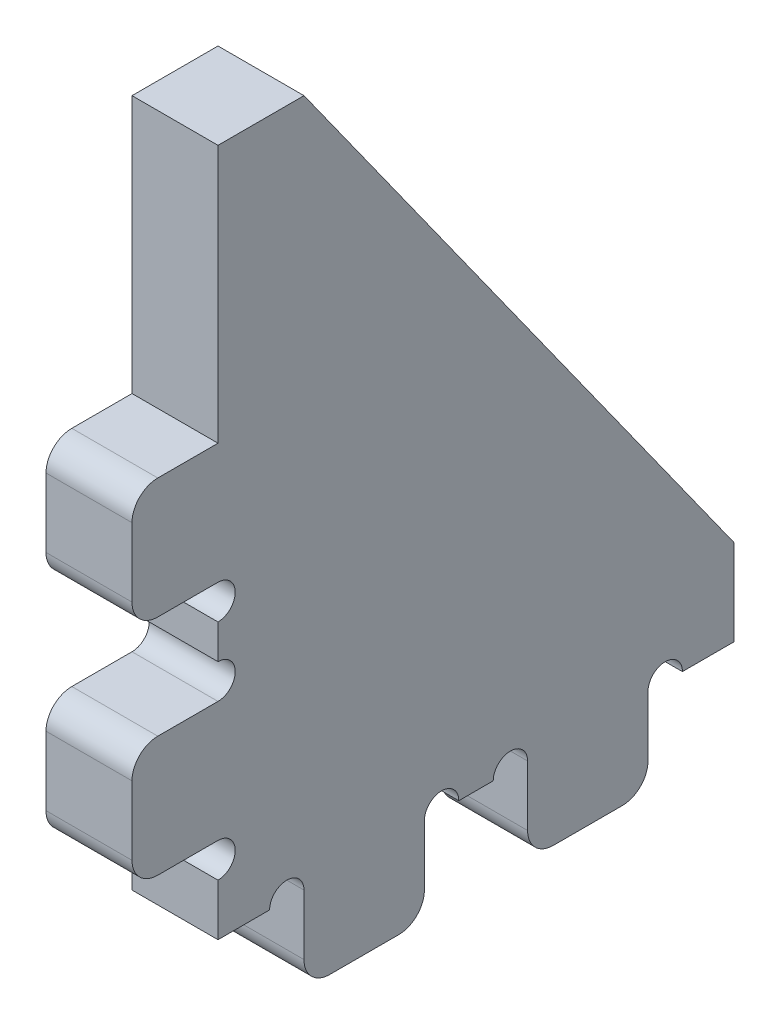
ISO-10303-21;
HEADER;
FILE_DESCRIPTION(('STEP AP214'),'2;1');
FILE_NAME('part.step','',(''),(''),'','','');
FILE_SCHEMA(('AUTOMOTIVE_DESIGN { 1 0 10303 214 1 1 1 1 }'));
ENDSEC;
DATA;
#1=APPLICATION_CONTEXT('core data for automotive mechanical design processes');
#2=APPLICATION_PROTOCOL_DEFINITION('international standard','automotive_design',2000,#1);
#3=PRODUCT_CONTEXT('',#1,'mechanical');
#4=PRODUCT('Part','Part','',(#3));
#5=PRODUCT_RELATED_PRODUCT_CATEGORY('part','',(#4));
#6=PRODUCT_DEFINITION_FORMATION('','',#4);
#7=PRODUCT_DEFINITION_CONTEXT('part definition',#1,'design');
#8=PRODUCT_DEFINITION('design','',#6,#7);
#9=PRODUCT_DEFINITION_SHAPE('','',#8);
#10=(LENGTH_UNIT() NAMED_UNIT(*) SI_UNIT(.MILLI.,.METRE.));
#11=(NAMED_UNIT(*) PLANE_ANGLE_UNIT() SI_UNIT($,.RADIAN.));
#12=(NAMED_UNIT(*) SI_UNIT($,.STERADIAN.) SOLID_ANGLE_UNIT());
#13=UNCERTAINTY_MEASURE_WITH_UNIT(LENGTH_MEASURE(1.E-05),#10,'distance_accuracy_value','');
#14=(GEOMETRIC_REPRESENTATION_CONTEXT(3) GLOBAL_UNCERTAINTY_ASSIGNED_CONTEXT((#13)) GLOBAL_UNIT_ASSIGNED_CONTEXT((#10,
#11,#12)) REPRESENTATION_CONTEXT('',''));
#15=CARTESIAN_POINT('',(0.,0.,0.));
#16=DIRECTION('',(0.,0.,1.));
#17=DIRECTION('',(1.,0.,0.));
#18=AXIS2_PLACEMENT_3D('',#15,#16,#17);
#19=CARTESIAN_POINT('',(5.,0.,0.));
#20=DIRECTION('',(0.,0.,-1.));
#21=DIRECTION('',(-1.,0.,0.));
#22=AXIS2_PLACEMENT_3D('',#19,#20,#21);
#23=PLANE('',#22);
#24=DIRECTION('',(0.,-1.,0.));
#25=VECTOR('',#24,1.);
#26=CARTESIAN_POINT('',(5.,0.,0.));
#27=LINE('',#26,#25);
#28=CARTESIAN_POINT('',(5.,16.,0.));
#29=VERTEX_POINT('',#28);
#30=CARTESIAN_POINT('',(5.,14.,0.));
#31=VERTEX_POINT('',#30);
#32=EDGE_CURVE('E286',#29,#31,#27,.T.);
#33=ORIENTED_EDGE('',*,*,#32,.F.);
#34=DIRECTION('',(1.,0.,0.));
#35=VECTOR('',#34,1.);
#36=CARTESIAN_POINT('',(0.,16.,0.));
#37=LINE('',#36,#35);
#38=CARTESIAN_POINT('',(0.,16.,0.));
#39=VERTEX_POINT('',#38);
#40=EDGE_CURVE('E269',#29,#39,#37,.F.);
#41=ORIENTED_EDGE('',*,*,#40,.T.);
#42=DIRECTION('',(0.,-1.,0.));
#43=VECTOR('',#42,1.);
#44=CARTESIAN_POINT('',(0.,0.,0.));
#45=LINE('',#44,#43);
#46=CARTESIAN_POINT('',(0.,14.,0.));
#47=VERTEX_POINT('',#46);
#48=EDGE_CURVE('E305',#39,#47,#45,.T.);
#49=ORIENTED_EDGE('',*,*,#48,.T.);
#50=DIRECTION('',(1.,0.,0.));
#51=VECTOR('',#50,1.);
#52=CARTESIAN_POINT('',(0.,14.,0.));
#53=LINE('',#52,#51);
#54=EDGE_CURVE('E293',#47,#31,#53,.T.);
#55=ORIENTED_EDGE('',*,*,#54,.T.);
#56=EDGE_LOOP('',(#33,#41,#49,#55));
#57=FACE_BOUND('',#56,.T.);
#58=ADVANCED_FACE('F34',(#57),#23,.F.);
#59=CARTESIAN_POINT('',(5.,3.,0.));
#60=VERTEX_POINT('',#59);
#61=CARTESIAN_POINT('',(5.,0.,0.));
#62=VERTEX_POINT('',#61);
#63=EDGE_CURVE('E295',#60,#62,#27,.T.);
#64=ORIENTED_EDGE('',*,*,#63,.F.);
#65=DIRECTION('',(1.,0.,0.));
#66=VECTOR('',#65,1.);
#67=CARTESIAN_POINT('',(0.,3.,0.));
#68=LINE('',#67,#66);
#69=CARTESIAN_POINT('',(0.,3.,0.));
#70=VERTEX_POINT('',#69);
#71=EDGE_CURVE('E507',#60,#70,#68,.F.);
#72=ORIENTED_EDGE('',*,*,#71,.T.);
#73=CARTESIAN_POINT('',(0.,0.,0.));
#74=VERTEX_POINT('',#73);
#75=EDGE_CURVE('E590',#70,#74,#45,.T.);
#76=ORIENTED_EDGE('',*,*,#75,.T.);
#77=DIRECTION('',(-1.,0.,0.));
#78=VECTOR('',#77,1.);
#79=CARTESIAN_POINT('',(5.,0.,0.));
#80=LINE('',#79,#78);
#81=EDGE_CURVE('E298',#62,#74,#80,.T.);
#82=ORIENTED_EDGE('',*,*,#81,.F.);
#83=EDGE_LOOP('',(#64,#72,#76,#82));
#84=FACE_BOUND('',#83,.T.);
#85=ADVANCED_FACE('F716',(#84),#23,.F.);
#86=CARTESIAN_POINT('',(5.,0.,-30.));
#87=DIRECTION('',(0.,1.,0.));
#88=DIRECTION('',(0.,0.,1.));
#89=AXIS2_PLACEMENT_3D('',#86,#87,#88);
#90=PLANE('',#89);
#91=DIRECTION('',(0.,0.,-1.));
#92=VECTOR('',#91,1.);
#93=CARTESIAN_POINT('',(0.,0.,-30.));
#94=LINE('',#93,#92);
#95=CARTESIAN_POINT('',(0.,0.,-14.));
#96=VERTEX_POINT('',#95);
#97=CARTESIAN_POINT('',(0.,0.,-16.));
#98=VERTEX_POINT('',#97);
#99=EDGE_CURVE('E563',#96,#98,#94,.T.);
#100=ORIENTED_EDGE('',*,*,#99,.T.);
#101=DIRECTION('',(1.,0.,0.));
#102=VECTOR('',#101,1.);
#103=CARTESIAN_POINT('',(0.,0.,-16.));
#104=LINE('',#103,#102);
#105=CARTESIAN_POINT('',(5.,0.,-16.));
#106=VERTEX_POINT('',#105);
#107=EDGE_CURVE('E525',#98,#106,#104,.T.);
#108=ORIENTED_EDGE('',*,*,#107,.T.);
#109=DIRECTION('',(0.,0.,-1.));
#110=VECTOR('',#109,1.);
#111=CARTESIAN_POINT('',(5.,0.,-30.));
#112=LINE('',#111,#110);
#113=CARTESIAN_POINT('',(5.,0.,-14.));
#114=VERTEX_POINT('',#113);
#115=EDGE_CURVE('E576',#114,#106,#112,.T.);
#116=ORIENTED_EDGE('',*,*,#115,.F.);
#117=DIRECTION('',(1.,0.,0.));
#118=VECTOR('',#117,1.);
#119=CARTESIAN_POINT('',(0.,0.,-14.));
#120=LINE('',#119,#118);
#121=EDGE_CURVE('E538',#114,#96,#120,.F.);
#122=ORIENTED_EDGE('',*,*,#121,.T.);
#123=EDGE_LOOP('',(#100,#108,#116,#122));
#124=FACE_BOUND('',#123,.T.);
#125=ADVANCED_FACE('F680',(#124),#90,.F.);
#126=CARTESIAN_POINT('',(5.,0.,-27.));
#127=VERTEX_POINT('',#126);
#128=CARTESIAN_POINT('',(5.,0.,-30.));
#129=VERTEX_POINT('',#128);
#130=EDGE_CURVE('E588',#127,#129,#112,.T.);
#131=ORIENTED_EDGE('',*,*,#130,.F.);
#132=DIRECTION('',(1.,0.,0.));
#133=VECTOR('',#132,1.);
#134=CARTESIAN_POINT('',(0.,0.,-27.));
#135=LINE('',#134,#133);
#136=CARTESIAN_POINT('',(0.,0.,-27.));
#137=VERTEX_POINT('',#136);
#138=EDGE_CURVE('E516',#127,#137,#135,.F.);
#139=ORIENTED_EDGE('',*,*,#138,.T.);
#140=CARTESIAN_POINT('',(0.,0.,-30.));
#141=VERTEX_POINT('',#140);
#142=EDGE_CURVE('E567',#137,#141,#94,.T.);
#143=ORIENTED_EDGE('',*,*,#142,.T.);
#144=DIRECTION('',(-1.,0.,0.));
#145=VECTOR('',#144,1.);
#146=CARTESIAN_POINT('',(5.,0.,-30.));
#147=LINE('',#146,#145);
#148=EDGE_CURVE('E570',#129,#141,#147,.T.);
#149=ORIENTED_EDGE('',*,*,#148,.F.);
#150=EDGE_LOOP('',(#131,#139,#143,#149));
#151=FACE_BOUND('',#150,.T.);
#152=ADVANCED_FACE('F703',(#151),#90,.F.);
#153=CARTESIAN_POINT('',(0.,0.,-3.));
#154=VERTEX_POINT('',#153);
#155=EDGE_CURVE('E552',#74,#154,#94,.T.);
#156=ORIENTED_EDGE('',*,*,#155,.T.);
#157=DIRECTION('',(1.,0.,0.));
#158=VECTOR('',#157,1.);
#159=CARTESIAN_POINT('',(0.,0.,-3.));
#160=LINE('',#159,#158);
#161=CARTESIAN_POINT('',(5.,0.,-3.));
#162=VERTEX_POINT('',#161);
#163=EDGE_CURVE('E458',#154,#162,#160,.T.);
#164=ORIENTED_EDGE('',*,*,#163,.T.);
#165=EDGE_CURVE('E572',#62,#162,#112,.T.);
#166=ORIENTED_EDGE('',*,*,#165,.F.);
#167=ORIENTED_EDGE('',*,*,#81,.T.);
#168=EDGE_LOOP('',(#156,#164,#166,#167));
#169=FACE_BOUND('',#168,.T.);
#170=ADVANCED_FACE('F558',(#169),#90,.F.);
#171=CARTESIAN_POINT('',(5.,5.,-30.));
#172=DIRECTION('',(0.,0.,1.));
#173=DIRECTION('',(1.,0.,0.));
#174=AXIS2_PLACEMENT_3D('',#171,#172,#173);
#175=PLANE('',#174);
#176=DIRECTION('',(0.,1.,0.));
#177=VECTOR('',#176,1.);
#178=CARTESIAN_POINT('',(0.,5.,-30.));
#179=LINE('',#178,#177);
#180=CARTESIAN_POINT('',(0.,5.,-30.));
#181=VERTEX_POINT('',#180);
#182=EDGE_CURVE('E562',#141,#181,#179,.T.);
#183=ORIENTED_EDGE('',*,*,#182,.T.);
#184=DIRECTION('',(-1.,0.,0.));
#185=VECTOR('',#184,1.);
#186=CARTESIAN_POINT('',(5.,5.,-30.));
#187=LINE('',#186,#185);
#188=CARTESIAN_POINT('',(5.,5.,-30.));
#189=VERTEX_POINT('',#188);
#190=EDGE_CURVE('E604',#189,#181,#187,.T.);
#191=ORIENTED_EDGE('',*,*,#190,.F.);
#192=DIRECTION('',(0.,1.,0.));
#193=VECTOR('',#192,1.);
#194=CARTESIAN_POINT('',(5.,5.,-30.));
#195=LINE('',#194,#193);
#196=EDGE_CURVE('E575',#129,#189,#195,.T.);
#197=ORIENTED_EDGE('',*,*,#196,.F.);
#198=ORIENTED_EDGE('',*,*,#148,.T.);
#199=EDGE_LOOP('',(#183,#191,#197,#198));
#200=FACE_BOUND('',#199,.T.);
#201=ADVANCED_FACE('F1010',(#200),#175,.F.);
#202=CARTESIAN_POINT('',(5.,40.,-5.));
#203=DIRECTION('',(0.,-0.581238193719096,0.813733471206735));
#204=DIRECTION('',(0.,-0.813733471206735,-0.581238193719096));
#205=AXIS2_PLACEMENT_3D('',#202,#203,#204);
#206=PLANE('',#205);
#207=DIRECTION('',(0.,0.813733471206735,0.581238193719096));
#208=VECTOR('',#207,1.);
#209=CARTESIAN_POINT('',(0.,40.,-5.));
#210=LINE('',#209,#208);
#211=CARTESIAN_POINT('',(0.,40.,-5.));
#212=VERTEX_POINT('',#211);
#213=EDGE_CURVE('E565',#181,#212,#210,.T.);
#214=ORIENTED_EDGE('',*,*,#213,.T.);
#215=DIRECTION('',(-1.,0.,0.));
#216=VECTOR('',#215,1.);
#217=CARTESIAN_POINT('',(5.,40.,-5.));
#218=LINE('',#217,#216);
#219=CARTESIAN_POINT('',(5.,40.,-5.));
#220=VERTEX_POINT('',#219);
#221=EDGE_CURVE('E602',#220,#212,#218,.T.);
#222=ORIENTED_EDGE('',*,*,#221,.F.);
#223=DIRECTION('',(0.,0.813733471206735,0.581238193719096));
#224=VECTOR('',#223,1.);
#225=CARTESIAN_POINT('',(5.,40.,-5.));
#226=LINE('',#225,#224);
#227=EDGE_CURVE('E1032',#189,#220,#226,.T.);
#228=ORIENTED_EDGE('',*,*,#227,.F.);
#229=ORIENTED_EDGE('',*,*,#190,.T.);
#230=EDGE_LOOP('',(#214,#222,#228,#229));
#231=FACE_BOUND('',#230,.T.);
#232=ADVANCED_FACE('F733',(#231),#206,.F.);
#233=CARTESIAN_POINT('',(5.,40.,0.));
#234=DIRECTION('',(0.,-1.,0.));
#235=DIRECTION('',(0.,0.,-1.));
#236=AXIS2_PLACEMENT_3D('',#233,#234,#235);
#237=PLANE('',#236);
#238=DIRECTION('',(0.,0.,1.));
#239=VECTOR('',#238,1.);
#240=CARTESIAN_POINT('',(0.,40.,0.));
#241=LINE('',#240,#239);
#242=CARTESIAN_POINT('',(0.,40.,0.));
#243=VERTEX_POINT('',#242);
#244=EDGE_CURVE('E591',#212,#243,#241,.T.);
#245=ORIENTED_EDGE('',*,*,#244,.T.);
#246=DIRECTION('',(-1.,0.,0.));
#247=VECTOR('',#246,1.);
#248=CARTESIAN_POINT('',(5.,40.,0.));
#249=LINE('',#248,#247);
#250=CARTESIAN_POINT('',(5.,40.,0.));
#251=VERTEX_POINT('',#250);
#252=EDGE_CURVE('E599',#251,#243,#249,.T.);
#253=ORIENTED_EDGE('',*,*,#252,.F.);
#254=DIRECTION('',(0.,0.,1.));
#255=VECTOR('',#254,1.);
#256=CARTESIAN_POINT('',(5.,40.,0.));
#257=LINE('',#256,#255);
#258=EDGE_CURVE('E300',#220,#251,#257,.T.);
#259=ORIENTED_EDGE('',*,*,#258,.F.);
#260=ORIENTED_EDGE('',*,*,#221,.T.);
#261=EDGE_LOOP('',(#245,#253,#259,#260));
#262=FACE_BOUND('',#261,.T.);
#263=ADVANCED_FACE('F726',(#262),#237,.F.);
#264=CARTESIAN_POINT('',(0.,25.,1.14491749414469E-13));
#265=VERTEX_POINT('',#264);
#266=EDGE_CURVE('E319',#243,#265,#45,.T.);
#267=ORIENTED_EDGE('',*,*,#266,.T.);
#268=DIRECTION('',(1.,0.,0.));
#269=VECTOR('',#268,1.);
#270=CARTESIAN_POINT('',(0.,25.,1.14491749414469E-13));
#271=LINE('',#270,#269);
#272=CARTESIAN_POINT('',(5.,25.,0.));
#273=VERTEX_POINT('',#272);
#274=EDGE_CURVE('E327',#265,#273,#271,.T.);
#275=ORIENTED_EDGE('',*,*,#274,.T.);
#276=EDGE_CURVE('E294',#251,#273,#27,.T.);
#277=ORIENTED_EDGE('',*,*,#276,.F.);
#278=ORIENTED_EDGE('',*,*,#252,.T.);
#279=EDGE_LOOP('',(#267,#275,#277,#278));
#280=FACE_BOUND('',#279,.T.);
#281=ADVANCED_FACE('F718',(#280),#23,.F.);
#282=CARTESIAN_POINT('',(5.,0.,0.));
#283=DIRECTION('',(-1.,0.,0.));
#284=DIRECTION('',(0.,0.,1.));
#285=AXIS2_PLACEMENT_3D('',#282,#283,#284);
#286=PLANE('',#285);
#287=DIRECTION('',(0.,0.,-1.));
#288=VECTOR('',#287,1.);
#289=CARTESIAN_POINT('',(5.,-5.,-18.));
#290=LINE('',#289,#288);
#291=CARTESIAN_POINT('',(5.,-5.,-19.5));
#292=VERTEX_POINT('',#291);
#293=CARTESIAN_POINT('',(5.,-5.,-23.5));
#294=VERTEX_POINT('',#293);
#295=EDGE_CURVE('E622',#292,#294,#290,.T.);
#296=ORIENTED_EDGE('',*,*,#295,.T.);
#297=CARTESIAN_POINT('',(5.,-3.5,-23.5));
#298=DIRECTION('',(-1.,0.,0.));
#299=DIRECTION('',(0.,0.,1.));
#300=AXIS2_PLACEMENT_3D('',#297,#298,#299);
#301=CIRCLE('',#300,1.5);
#302=CARTESIAN_POINT('',(5.,-3.5,-25.));
#303=VERTEX_POINT('',#302);
#304=EDGE_CURVE('E388',#294,#303,#301,.F.);
#305=ORIENTED_EDGE('',*,*,#304,.T.);
#306=DIRECTION('',(0.,1.,0.));
#307=VECTOR('',#306,1.);
#308=CARTESIAN_POINT('',(5.,0.,-25.));
#309=LINE('',#308,#307);
#310=CARTESIAN_POINT('',(5.,0.,-25.));
#311=VERTEX_POINT('',#310);
#312=EDGE_CURVE('E627',#303,#311,#309,.T.);
#313=ORIENTED_EDGE('',*,*,#312,.T.);
#314=CARTESIAN_POINT('',(5.,0.,-26.));
#315=DIRECTION('',(1.,0.,0.));
#316=DIRECTION('',(0.,0.,-1.));
#317=AXIS2_PLACEMENT_3D('',#314,#315,#316);
#318=CIRCLE('',#317,1.);
#319=EDGE_CURVE('E512',#127,#311,#318,.T.);
#320=ORIENTED_EDGE('',*,*,#319,.F.);
#321=ORIENTED_EDGE('',*,*,#130,.T.);
#322=ORIENTED_EDGE('',*,*,#196,.T.);
#323=ORIENTED_EDGE('',*,*,#227,.T.);
#324=ORIENTED_EDGE('',*,*,#258,.T.);
#325=ORIENTED_EDGE('',*,*,#276,.T.);
#326=DIRECTION('',(0.,0.,1.));
#327=VECTOR('',#326,1.);
#328=CARTESIAN_POINT('',(5.,25.,1.14491749414469E-13));
#329=LINE('',#328,#327);
#330=CARTESIAN_POINT('',(5.,25.,3.50000000000012));
#331=VERTEX_POINT('',#330);
#332=EDGE_CURVE('E321',#273,#331,#329,.T.);
#333=ORIENTED_EDGE('',*,*,#332,.T.);
#334=CARTESIAN_POINT('',(5.,23.5,3.50000000000011));
#335=DIRECTION('',(-1.,0.,0.));
#336=DIRECTION('',(0.,0.,1.));
#337=AXIS2_PLACEMENT_3D('',#334,#335,#336);
#338=CIRCLE('',#337,1.5);
#339=CARTESIAN_POINT('',(5.,23.5,5.00000000000011));
#340=VERTEX_POINT('',#339);
#341=EDGE_CURVE('E383',#331,#340,#338,.F.);
#342=ORIENTED_EDGE('',*,*,#341,.T.);
#343=DIRECTION('',(0.,-1.,0.));
#344=VECTOR('',#343,1.);
#345=CARTESIAN_POINT('',(5.,18.,5.00000000000008));
#346=LINE('',#345,#344);
#347=CARTESIAN_POINT('',(5.,19.5,5.00000000000009));
#348=VERTEX_POINT('',#347);
#349=EDGE_CURVE('E324',#340,#348,#346,.T.);
#350=ORIENTED_EDGE('',*,*,#349,.T.);
#351=CARTESIAN_POINT('',(5.,19.5,3.50000000000009));
#352=DIRECTION('',(-1.,0.,0.));
#353=DIRECTION('',(0.,0.,1.));
#354=AXIS2_PLACEMENT_3D('',#351,#352,#353);
#355=CIRCLE('',#354,1.5);
#356=CARTESIAN_POINT('',(5.,18.,3.50000000000008));
#357=VERTEX_POINT('',#356);
#358=EDGE_CURVE('E381',#348,#357,#355,.F.);
#359=ORIENTED_EDGE('',*,*,#358,.T.);
#360=DIRECTION('',(0.,0.,-1.));
#361=VECTOR('',#360,1.);
#362=CARTESIAN_POINT('',(5.,18.,0.));
#363=LINE('',#362,#361);
#364=CARTESIAN_POINT('',(5.,18.,0.));
#365=VERTEX_POINT('',#364);
#366=EDGE_CURVE('E289',#357,#365,#363,.T.);
#367=ORIENTED_EDGE('',*,*,#366,.T.);
#368=CARTESIAN_POINT('',(5.,17.,0.));
#369=DIRECTION('',(1.,0.,0.));
#370=DIRECTION('',(0.,0.,-1.));
#371=AXIS2_PLACEMENT_3D('',#368,#369,#370);
#372=CIRCLE('',#371,1.);
#373=EDGE_CURVE('E273',#29,#365,#372,.T.);
#374=ORIENTED_EDGE('',*,*,#373,.F.);
#375=ORIENTED_EDGE('',*,*,#32,.T.);
#376=CARTESIAN_POINT('',(5.,13.,0.));
#377=DIRECTION('',(1.,0.,0.));
#378=DIRECTION('',(0.,0.,-1.));
#379=AXIS2_PLACEMENT_3D('',#376,#377,#378);
#380=CIRCLE('',#379,1.);
#381=CARTESIAN_POINT('',(5.,12.,0.));
#382=VERTEX_POINT('',#381);
#383=EDGE_CURVE('E280',#382,#31,#380,.T.);
#384=ORIENTED_EDGE('',*,*,#383,.F.);
#385=DIRECTION('',(0.,0.,1.));
#386=VECTOR('',#385,1.);
#387=CARTESIAN_POINT('',(5.,12.,0.));
#388=LINE('',#387,#386);
#389=CARTESIAN_POINT('',(5.,12.,3.50000000000005));
#390=VERTEX_POINT('',#389);
#391=EDGE_CURVE('E460',#382,#390,#388,.T.);
#392=ORIENTED_EDGE('',*,*,#391,.T.);
#393=CARTESIAN_POINT('',(5.,10.5,3.50000000000005));
#394=DIRECTION('',(-1.,0.,0.));
#395=DIRECTION('',(0.,0.,1.));
#396=AXIS2_PLACEMENT_3D('',#393,#394,#395);
#397=CIRCLE('',#396,1.5);
#398=CARTESIAN_POINT('',(5.,10.5,5.00000000000005));
#399=VERTEX_POINT('',#398);
#400=EDGE_CURVE('E374',#390,#399,#397,.F.);
#401=ORIENTED_EDGE('',*,*,#400,.T.);
#402=DIRECTION('',(0.,-1.,0.));
#403=VECTOR('',#402,1.);
#404=CARTESIAN_POINT('',(5.,4.99999999999998,5.00000000000002));
#405=LINE('',#404,#403);
#406=CARTESIAN_POINT('',(5.,6.49999999999998,5.00000000000003));
#407=VERTEX_POINT('',#406);
#408=EDGE_CURVE('E455',#399,#407,#405,.T.);
#409=ORIENTED_EDGE('',*,*,#408,.T.);
#410=CARTESIAN_POINT('',(5.,6.49999999999998,3.50000000000003));
#411=DIRECTION('',(-1.,0.,0.));
#412=DIRECTION('',(0.,0.,1.));
#413=AXIS2_PLACEMENT_3D('',#410,#411,#412);
#414=CIRCLE('',#413,1.5);
#415=CARTESIAN_POINT('',(5.,4.99999999999999,3.50000000000002));
#416=VERTEX_POINT('',#415);
#417=EDGE_CURVE('E376',#407,#416,#414,.F.);
#418=ORIENTED_EDGE('',*,*,#417,.T.);
#419=DIRECTION('',(0.,0.,-1.));
#420=VECTOR('',#419,1.);
#421=CARTESIAN_POINT('',(5.,5.,0.));
#422=LINE('',#421,#420);
#423=CARTESIAN_POINT('',(5.,5.,0.));
#424=VERTEX_POINT('',#423);
#425=EDGE_CURVE('E440',#416,#424,#422,.T.);
#426=ORIENTED_EDGE('',*,*,#425,.T.);
#427=CARTESIAN_POINT('',(5.,4.,0.));
#428=DIRECTION('',(1.,0.,0.));
#429=DIRECTION('',(0.,0.,-1.));
#430=AXIS2_PLACEMENT_3D('',#427,#428,#429);
#431=CIRCLE('',#430,1.);
#432=EDGE_CURVE('E505',#60,#424,#431,.T.);
#433=ORIENTED_EDGE('',*,*,#432,.F.);
#434=ORIENTED_EDGE('',*,*,#63,.T.);
#435=ORIENTED_EDGE('',*,*,#165,.T.);
#436=CARTESIAN_POINT('',(5.,0.,-4.));
#437=DIRECTION('',(1.,0.,0.));
#438=DIRECTION('',(0.,0.,-1.));
#439=AXIS2_PLACEMENT_3D('',#436,#437,#438);
#440=CIRCLE('',#439,1.);
#441=CARTESIAN_POINT('',(5.,0.,-5.));
#442=VERTEX_POINT('',#441);
#443=EDGE_CURVE('E541',#442,#162,#440,.T.);
#444=ORIENTED_EDGE('',*,*,#443,.F.);
#445=DIRECTION('',(0.,-1.,0.));
#446=VECTOR('',#445,1.);
#447=CARTESIAN_POINT('',(5.,0.,-5.));
#448=LINE('',#447,#446);
#449=CARTESIAN_POINT('',(5.,-3.5,-5.));
#450=VERTEX_POINT('',#449);
#451=EDGE_CURVE('E577',#442,#450,#448,.T.);
#452=ORIENTED_EDGE('',*,*,#451,.T.);
#453=CARTESIAN_POINT('',(5.,-3.5,-6.5));
#454=DIRECTION('',(-1.,0.,0.));
#455=DIRECTION('',(0.,0.,1.));
#456=AXIS2_PLACEMENT_3D('',#453,#454,#455);
#457=CIRCLE('',#456,1.5);
#458=CARTESIAN_POINT('',(5.,-5.,-6.5));
#459=VERTEX_POINT('',#458);
#460=EDGE_CURVE('E379',#450,#459,#457,.F.);
#461=ORIENTED_EDGE('',*,*,#460,.T.);
#462=DIRECTION('',(0.,0.,-1.));
#463=VECTOR('',#462,1.);
#464=CARTESIAN_POINT('',(5.,-5.,-5.));
#465=LINE('',#464,#463);
#466=CARTESIAN_POINT('',(5.,-5.,-10.5));
#467=VERTEX_POINT('',#466);
#468=EDGE_CURVE('E373',#459,#467,#465,.T.);
#469=ORIENTED_EDGE('',*,*,#468,.T.);
#470=CARTESIAN_POINT('',(5.,-3.5,-10.5));
#471=DIRECTION('',(-1.,0.,0.));
#472=DIRECTION('',(0.,0.,1.));
#473=AXIS2_PLACEMENT_3D('',#470,#471,#472);
#474=CIRCLE('',#473,1.5);
#475=CARTESIAN_POINT('',(5.,-3.5,-12.));
#476=VERTEX_POINT('',#475);
#477=EDGE_CURVE('E387',#467,#476,#474,.F.);
#478=ORIENTED_EDGE('',*,*,#477,.T.);
#479=DIRECTION('',(0.,1.,0.));
#480=VECTOR('',#479,1.);
#481=CARTESIAN_POINT('',(5.,0.,-12.));
#482=LINE('',#481,#480);
#483=CARTESIAN_POINT('',(5.,0.,-12.));
#484=VERTEX_POINT('',#483);
#485=EDGE_CURVE('E369',#476,#484,#482,.T.);
#486=ORIENTED_EDGE('',*,*,#485,.T.);
#487=CARTESIAN_POINT('',(5.,0.,-13.));
#488=DIRECTION('',(1.,0.,0.));
#489=DIRECTION('',(0.,0.,-1.));
#490=AXIS2_PLACEMENT_3D('',#487,#488,#489);
#491=CIRCLE('',#490,1.);
#492=EDGE_CURVE('E529',#114,#484,#491,.T.);
#493=ORIENTED_EDGE('',*,*,#492,.F.);
#494=ORIENTED_EDGE('',*,*,#115,.T.);
#495=CARTESIAN_POINT('',(5.,0.,-17.));
#496=DIRECTION('',(1.,0.,0.));
#497=DIRECTION('',(0.,0.,-1.));
#498=AXIS2_PLACEMENT_3D('',#495,#496,#497);
#499=CIRCLE('',#498,1.);
#500=CARTESIAN_POINT('',(5.,0.,-18.));
#501=VERTEX_POINT('',#500);
#502=EDGE_CURVE('E521',#501,#106,#499,.T.);
#503=ORIENTED_EDGE('',*,*,#502,.F.);
#504=DIRECTION('',(0.,-1.,0.));
#505=VECTOR('',#504,1.);
#506=CARTESIAN_POINT('',(5.,0.,-18.));
#507=LINE('',#506,#505);
#508=CARTESIAN_POINT('',(5.,-3.5,-18.));
#509=VERTEX_POINT('',#508);
#510=EDGE_CURVE('E331',#501,#509,#507,.T.);
#511=ORIENTED_EDGE('',*,*,#510,.T.);
#512=CARTESIAN_POINT('',(5.,-3.5,-19.5));
#513=DIRECTION('',(-1.,0.,0.));
#514=DIRECTION('',(0.,0.,1.));
#515=AXIS2_PLACEMENT_3D('',#512,#513,#514);
#516=CIRCLE('',#515,1.5);
#517=EDGE_CURVE('E385',#509,#292,#516,.F.);
#518=ORIENTED_EDGE('',*,*,#517,.T.);
#519=EDGE_LOOP('',(#296,#305,#313,#320,#321,#322,#323,#324,#325,#333,#342,#350,#359,#367,#374,
#375,#384,#392,#401,#409,#418,#426,#433,#434,#435,#444,#452,#461,#469,#478,#486,#493,#494,#503,
#511,#518));
#520=FACE_BOUND('',#519,.T.);
#521=ADVANCED_FACE('F284',(#520),#286,.F.);
#522=CARTESIAN_POINT('',(0.,0.,0.));
#523=DIRECTION('',(-1.,0.,0.));
#524=DIRECTION('',(0.,0.,1.));
#525=AXIS2_PLACEMENT_3D('',#522,#523,#524);
#526=PLANE('',#525);
#527=DIRECTION('',(0.,1.,0.));
#528=VECTOR('',#527,1.);
#529=CARTESIAN_POINT('',(0.,0.,-25.));
#530=LINE('',#529,#528);
#531=CARTESIAN_POINT('',(0.,-3.5,-25.));
#532=VERTEX_POINT('',#531);
#533=CARTESIAN_POINT('',(0.,0.,-25.));
#534=VERTEX_POINT('',#533);
#535=EDGE_CURVE('E638',#532,#534,#530,.T.);
#536=ORIENTED_EDGE('',*,*,#535,.F.);
#537=CARTESIAN_POINT('',(0.,-3.5,-23.5));
#538=DIRECTION('',(-1.,0.,0.));
#539=DIRECTION('',(0.,0.,1.));
#540=AXIS2_PLACEMENT_3D('',#537,#538,#539);
#541=CIRCLE('',#540,1.5);
#542=CARTESIAN_POINT('',(0.,-5.,-23.5));
#543=VERTEX_POINT('',#542);
#544=EDGE_CURVE('E404',#532,#543,#541,.T.);
#545=ORIENTED_EDGE('',*,*,#544,.T.);
#546=DIRECTION('',(0.,0.,-1.));
#547=VECTOR('',#546,1.);
#548=CARTESIAN_POINT('',(0.,-5.,-18.));
#549=LINE('',#548,#547);
#550=CARTESIAN_POINT('',(0.,-5.,-19.5));
#551=VERTEX_POINT('',#550);
#552=EDGE_CURVE('E623',#551,#543,#549,.T.);
#553=ORIENTED_EDGE('',*,*,#552,.F.);
#554=CARTESIAN_POINT('',(0.,-3.5,-19.5));
#555=DIRECTION('',(-1.,0.,0.));
#556=DIRECTION('',(0.,0.,1.));
#557=AXIS2_PLACEMENT_3D('',#554,#555,#556);
#558=CIRCLE('',#557,1.5);
#559=CARTESIAN_POINT('',(0.,-3.5,-18.));
#560=VERTEX_POINT('',#559);
#561=EDGE_CURVE('E400',#551,#560,#558,.T.);
#562=ORIENTED_EDGE('',*,*,#561,.T.);
#563=DIRECTION('',(0.,-1.,0.));
#564=VECTOR('',#563,1.);
#565=CARTESIAN_POINT('',(0.,0.,-18.));
#566=LINE('',#565,#564);
#567=CARTESIAN_POINT('',(0.,0.,-18.));
#568=VERTEX_POINT('',#567);
#569=EDGE_CURVE('E341',#568,#560,#566,.T.);
#570=ORIENTED_EDGE('',*,*,#569,.F.);
#571=CARTESIAN_POINT('',(0.,0.,-17.));
#572=DIRECTION('',(1.,0.,0.));
#573=DIRECTION('',(0.,0.,-1.));
#574=AXIS2_PLACEMENT_3D('',#571,#572,#573);
#575=CIRCLE('',#574,1.);
#576=EDGE_CURVE('E522',#568,#98,#575,.T.);
#577=ORIENTED_EDGE('',*,*,#576,.T.);
#578=ORIENTED_EDGE('',*,*,#99,.F.);
#579=CARTESIAN_POINT('',(0.,0.,-13.));
#580=DIRECTION('',(1.,0.,0.));
#581=DIRECTION('',(0.,0.,-1.));
#582=AXIS2_PLACEMENT_3D('',#579,#580,#581);
#583=CIRCLE('',#582,1.);
#584=CARTESIAN_POINT('',(0.,0.,-12.));
#585=VERTEX_POINT('',#584);
#586=EDGE_CURVE('E535',#96,#585,#583,.T.);
#587=ORIENTED_EDGE('',*,*,#586,.T.);
#588=DIRECTION('',(0.,1.,0.));
#589=VECTOR('',#588,1.);
#590=CARTESIAN_POINT('',(0.,0.,-12.));
#591=LINE('',#590,#589);
#592=CARTESIAN_POINT('',(0.,-3.5,-12.));
#593=VERTEX_POINT('',#592);
#594=EDGE_CURVE('E357',#593,#585,#591,.T.);
#595=ORIENTED_EDGE('',*,*,#594,.F.);
#596=CARTESIAN_POINT('',(0.,-3.5,-10.5));
#597=DIRECTION('',(-1.,0.,0.));
#598=DIRECTION('',(0.,0.,1.));
#599=AXIS2_PLACEMENT_3D('',#596,#597,#598);
#600=CIRCLE('',#599,1.5);
#601=CARTESIAN_POINT('',(0.,-5.,-10.5));
#602=VERTEX_POINT('',#601);
#603=EDGE_CURVE('E402',#593,#602,#600,.T.);
#604=ORIENTED_EDGE('',*,*,#603,.T.);
#605=DIRECTION('',(0.,0.,-1.));
#606=VECTOR('',#605,1.);
#607=CARTESIAN_POINT('',(0.,-5.,-5.));
#608=LINE('',#607,#606);
#609=CARTESIAN_POINT('',(0.,-5.,-6.5));
#610=VERTEX_POINT('',#609);
#611=EDGE_CURVE('E361',#610,#602,#608,.T.);
#612=ORIENTED_EDGE('',*,*,#611,.F.);
#613=CARTESIAN_POINT('',(0.,-3.5,-6.5));
#614=DIRECTION('',(-1.,0.,0.));
#615=DIRECTION('',(0.,0.,1.));
#616=AXIS2_PLACEMENT_3D('',#613,#614,#615);
#617=CIRCLE('',#616,1.5);
#618=CARTESIAN_POINT('',(0.,-3.5,-5.));
#619=VERTEX_POINT('',#618);
#620=EDGE_CURVE('E393',#610,#619,#617,.T.);
#621=ORIENTED_EDGE('',*,*,#620,.T.);
#622=DIRECTION('',(0.,-1.,0.));
#623=VECTOR('',#622,1.);
#624=CARTESIAN_POINT('',(0.,0.,-5.));
#625=LINE('',#624,#623);
#626=CARTESIAN_POINT('',(0.,0.,-5.));
#627=VERTEX_POINT('',#626);
#628=EDGE_CURVE('E372',#627,#619,#625,.T.);
#629=ORIENTED_EDGE('',*,*,#628,.F.);
#630=CARTESIAN_POINT('',(0.,0.,-4.));
#631=DIRECTION('',(1.,0.,0.));
#632=DIRECTION('',(0.,0.,-1.));
#633=AXIS2_PLACEMENT_3D('',#630,#631,#632);
#634=CIRCLE('',#633,1.);
#635=EDGE_CURVE('E463',#627,#154,#634,.T.);
#636=ORIENTED_EDGE('',*,*,#635,.T.);
#637=ORIENTED_EDGE('',*,*,#155,.F.);
#638=ORIENTED_EDGE('',*,*,#75,.F.);
#639=CARTESIAN_POINT('',(0.,4.,0.));
#640=DIRECTION('',(1.,0.,0.));
#641=DIRECTION('',(0.,0.,-1.));
#642=AXIS2_PLACEMENT_3D('',#639,#640,#641);
#643=CIRCLE('',#642,1.);
#644=CARTESIAN_POINT('',(0.,5.,0.));
#645=VERTEX_POINT('',#644);
#646=EDGE_CURVE('E445',#70,#645,#643,.T.);
#647=ORIENTED_EDGE('',*,*,#646,.T.);
#648=DIRECTION('',(0.,0.,-1.));
#649=VECTOR('',#648,1.);
#650=CARTESIAN_POINT('',(0.,5.,0.));
#651=LINE('',#650,#649);
#652=CARTESIAN_POINT('',(0.,4.99999999999999,3.50000000000002));
#653=VERTEX_POINT('',#652);
#654=EDGE_CURVE('E438',#653,#645,#651,.T.);
#655=ORIENTED_EDGE('',*,*,#654,.F.);
#656=CARTESIAN_POINT('',(0.,6.49999999999998,3.50000000000003));
#657=DIRECTION('',(-1.,0.,0.));
#658=DIRECTION('',(0.,0.,1.));
#659=AXIS2_PLACEMENT_3D('',#656,#657,#658);
#660=CIRCLE('',#659,1.5);
#661=CARTESIAN_POINT('',(0.,6.49999999999998,5.00000000000003));
#662=VERTEX_POINT('',#661);
#663=EDGE_CURVE('E55',#653,#662,#660,.T.);
#664=ORIENTED_EDGE('',*,*,#663,.T.);
#665=DIRECTION('',(0.,-1.,0.));
#666=VECTOR('',#665,1.);
#667=CARTESIAN_POINT('',(0.,4.99999999999998,5.00000000000002));
#668=LINE('',#667,#666);
#669=CARTESIAN_POINT('',(0.,10.5,5.00000000000005));
#670=VERTEX_POINT('',#669);
#671=EDGE_CURVE('E447',#670,#662,#668,.T.);
#672=ORIENTED_EDGE('',*,*,#671,.F.);
#673=CARTESIAN_POINT('',(0.,10.5,3.50000000000005));
#674=DIRECTION('',(-1.,0.,0.));
#675=DIRECTION('',(0.,0.,1.));
#676=AXIS2_PLACEMENT_3D('',#673,#674,#675);
#677=CIRCLE('',#676,1.5);
#678=CARTESIAN_POINT('',(0.,12.,3.50000000000005));
#679=VERTEX_POINT('',#678);
#680=EDGE_CURVE('E49',#670,#679,#677,.T.);
#681=ORIENTED_EDGE('',*,*,#680,.T.);
#682=DIRECTION('',(0.,0.,1.));
#683=VECTOR('',#682,1.);
#684=CARTESIAN_POINT('',(0.,12.,0.));
#685=LINE('',#684,#683);
#686=CARTESIAN_POINT('',(0.,12.,0.));
#687=VERTEX_POINT('',#686);
#688=EDGE_CURVE('E446',#687,#679,#685,.T.);
#689=ORIENTED_EDGE('',*,*,#688,.F.);
#690=CARTESIAN_POINT('',(0.,13.,0.));
#691=DIRECTION('',(1.,0.,0.));
#692=DIRECTION('',(0.,0.,-1.));
#693=AXIS2_PLACEMENT_3D('',#690,#691,#692);
#694=CIRCLE('',#693,1.);
#695=EDGE_CURVE('E501',#687,#47,#694,.T.);
#696=ORIENTED_EDGE('',*,*,#695,.T.);
#697=ORIENTED_EDGE('',*,*,#48,.F.);
#698=CARTESIAN_POINT('',(0.,17.,0.));
#699=DIRECTION('',(1.,0.,0.));
#700=DIRECTION('',(0.,0.,-1.));
#701=AXIS2_PLACEMENT_3D('',#698,#699,#700);
#702=CIRCLE('',#701,1.);
#703=CARTESIAN_POINT('',(0.,18.,0.));
#704=VERTEX_POINT('',#703);
#705=EDGE_CURVE('E276',#39,#704,#702,.T.);
#706=ORIENTED_EDGE('',*,*,#705,.T.);
#707=DIRECTION('',(0.,0.,-1.));
#708=VECTOR('',#707,1.);
#709=CARTESIAN_POINT('',(0.,18.,0.));
#710=LINE('',#709,#708);
#711=CARTESIAN_POINT('',(0.,18.,3.50000000000008));
#712=VERTEX_POINT('',#711);
#713=EDGE_CURVE('E352',#712,#704,#710,.T.);
#714=ORIENTED_EDGE('',*,*,#713,.F.);
#715=CARTESIAN_POINT('',(0.,19.5,3.50000000000009));
#716=DIRECTION('',(-1.,0.,0.));
#717=DIRECTION('',(0.,0.,1.));
#718=AXIS2_PLACEMENT_3D('',#715,#716,#717);
#719=CIRCLE('',#718,1.5);
#720=CARTESIAN_POINT('',(0.,19.5,5.00000000000009));
#721=VERTEX_POINT('',#720);
#722=EDGE_CURVE('E394',#712,#721,#719,.T.);
#723=ORIENTED_EDGE('',*,*,#722,.T.);
#724=DIRECTION('',(0.,-1.,0.));
#725=VECTOR('',#724,1.);
#726=CARTESIAN_POINT('',(0.,18.,5.00000000000008));
#727=LINE('',#726,#725);
#728=CARTESIAN_POINT('',(0.,23.5,5.00000000000011));
#729=VERTEX_POINT('',#728);
#730=EDGE_CURVE('E345',#729,#721,#727,.T.);
#731=ORIENTED_EDGE('',*,*,#730,.F.);
#732=CARTESIAN_POINT('',(0.,23.5,3.50000000000011));
#733=DIRECTION('',(-1.,0.,0.));
#734=DIRECTION('',(0.,0.,1.));
#735=AXIS2_PLACEMENT_3D('',#732,#733,#734);
#736=CIRCLE('',#735,1.5);
#737=CARTESIAN_POINT('',(0.,25.,3.50000000000012));
#738=VERTEX_POINT('',#737);
#739=EDGE_CURVE('E398',#729,#738,#736,.T.);
#740=ORIENTED_EDGE('',*,*,#739,.T.);
#741=DIRECTION('',(0.,0.,1.));
#742=VECTOR('',#741,1.);
#743=CARTESIAN_POINT('',(0.,25.,1.14491749414469E-13));
#744=LINE('',#743,#742);
#745=EDGE_CURVE('E333',#265,#738,#744,.T.);
#746=ORIENTED_EDGE('',*,*,#745,.F.);
#747=ORIENTED_EDGE('',*,*,#266,.F.);
#748=ORIENTED_EDGE('',*,*,#244,.F.);
#749=ORIENTED_EDGE('',*,*,#213,.F.);
#750=ORIENTED_EDGE('',*,*,#182,.F.);
#751=ORIENTED_EDGE('',*,*,#142,.F.);
#752=CARTESIAN_POINT('',(0.,0.,-26.));
#753=DIRECTION('',(1.,0.,0.));
#754=DIRECTION('',(0.,0.,-1.));
#755=AXIS2_PLACEMENT_3D('',#752,#753,#754);
#756=CIRCLE('',#755,1.);
#757=EDGE_CURVE('E513',#137,#534,#756,.T.);
#758=ORIENTED_EDGE('',*,*,#757,.T.);
#759=EDGE_LOOP('',(#536,#545,#553,#562,#570,#577,#578,#587,#595,#604,#612,#621,#629,#636,#637,
#638,#647,#655,#664,#672,#681,#689,#696,#697,#706,#714,#723,#731,#740,#746,#747,#748,#749,#750,
#751,#758));
#760=FACE_BOUND('',#759,.T.);
#761=ADVANCED_FACE('F443',(#760),#526,.T.);
#762=CARTESIAN_POINT('',(0.,0.,-5.));
#763=DIRECTION('',(0.,0.,1.));
#764=DIRECTION('',(0.,-1.,0.));
#765=AXIS2_PLACEMENT_3D('',#762,#763,#764);
#766=PLANE('',#765);
#767=ORIENTED_EDGE('',*,*,#628,.T.);
#768=DIRECTION('',(1.,0.,0.));
#769=VECTOR('',#768,1.);
#770=CARTESIAN_POINT('',(0.,-3.5,-5.));
#771=LINE('',#770,#769);
#772=EDGE_CURVE('E426',#619,#450,#771,.T.);
#773=ORIENTED_EDGE('',*,*,#772,.T.);
#774=ORIENTED_EDGE('',*,*,#451,.F.);
#775=DIRECTION('',(1.,0.,0.));
#776=VECTOR('',#775,1.);
#777=CARTESIAN_POINT('',(0.,0.,-5.));
#778=LINE('',#777,#776);
#779=EDGE_CURVE('E644',#627,#442,#778,.T.);
#780=ORIENTED_EDGE('',*,*,#779,.F.);
#781=EDGE_LOOP('',(#767,#773,#774,#780));
#782=FACE_BOUND('',#781,.T.);
#783=ADVANCED_FACE('F650',(#782),#766,.T.);
#784=CARTESIAN_POINT('',(0.,0.,-12.));
#785=DIRECTION('',(0.,0.,-1.));
#786=DIRECTION('',(-1.,0.,0.));
#787=AXIS2_PLACEMENT_3D('',#784,#785,#786);
#788=PLANE('',#787);
#789=ORIENTED_EDGE('',*,*,#485,.F.);
#790=DIRECTION('',(1.,0.,0.));
#791=VECTOR('',#790,1.);
#792=CARTESIAN_POINT('',(0.,-3.5,-12.));
#793=LINE('',#792,#791);
#794=EDGE_CURVE('E411',#476,#593,#793,.F.);
#795=ORIENTED_EDGE('',*,*,#794,.T.);
#796=ORIENTED_EDGE('',*,*,#594,.T.);
#797=DIRECTION('',(1.,0.,0.));
#798=VECTOR('',#797,1.);
#799=CARTESIAN_POINT('',(0.,0.,-12.));
#800=LINE('',#799,#798);
#801=EDGE_CURVE('E360',#585,#484,#800,.T.);
#802=ORIENTED_EDGE('',*,*,#801,.T.);
#803=EDGE_LOOP('',(#789,#795,#796,#802));
#804=FACE_BOUND('',#803,.T.);
#805=ADVANCED_FACE('F672',(#804),#788,.T.);
#806=CARTESIAN_POINT('',(0.,-5.,-5.));
#807=DIRECTION('',(0.,-1.,0.));
#808=DIRECTION('',(0.,0.,-1.));
#809=AXIS2_PLACEMENT_3D('',#806,#807,#808);
#810=PLANE('',#809);
#811=ORIENTED_EDGE('',*,*,#611,.T.);
#812=DIRECTION('',(1.,0.,0.));
#813=VECTOR('',#812,1.);
#814=CARTESIAN_POINT('',(0.,-5.,-10.5));
#815=LINE('',#814,#813);
#816=EDGE_CURVE('E408',#602,#467,#815,.T.);
#817=ORIENTED_EDGE('',*,*,#816,.T.);
#818=ORIENTED_EDGE('',*,*,#468,.F.);
#819=DIRECTION('',(1.,0.,0.));
#820=VECTOR('',#819,1.);
#821=CARTESIAN_POINT('',(0.,-5.,-6.5));
#822=LINE('',#821,#820);
#823=EDGE_CURVE('E406',#459,#610,#822,.F.);
#824=ORIENTED_EDGE('',*,*,#823,.T.);
#825=EDGE_LOOP('',(#811,#817,#818,#824));
#826=FACE_BOUND('',#825,.T.);
#827=ADVANCED_FACE('F660',(#826),#810,.T.);
#828=CARTESIAN_POINT('',(0.,0.,-18.));
#829=DIRECTION('',(0.,0.,1.));
#830=DIRECTION('',(1.,0.,0.));
#831=AXIS2_PLACEMENT_3D('',#828,#829,#830);
#832=PLANE('',#831);
#833=ORIENTED_EDGE('',*,*,#569,.T.);
#834=DIRECTION('',(1.,0.,0.));
#835=VECTOR('',#834,1.);
#836=CARTESIAN_POINT('',(0.,-3.5,-18.));
#837=LINE('',#836,#835);
#838=EDGE_CURVE('E413',#560,#509,#837,.T.);
#839=ORIENTED_EDGE('',*,*,#838,.T.);
#840=ORIENTED_EDGE('',*,*,#510,.F.);
#841=DIRECTION('',(1.,0.,0.));
#842=VECTOR('',#841,1.);
#843=CARTESIAN_POINT('',(0.,0.,-18.));
#844=LINE('',#843,#842);
#845=EDGE_CURVE('E633',#568,#501,#844,.T.);
#846=ORIENTED_EDGE('',*,*,#845,.F.);
#847=EDGE_LOOP('',(#833,#839,#840,#846));
#848=FACE_BOUND('',#847,.T.);
#849=ADVANCED_FACE('F689',(#848),#832,.T.);
#850=CARTESIAN_POINT('',(0.,0.,-25.));
#851=DIRECTION('',(0.,0.,-1.));
#852=DIRECTION('',(-1.,0.,0.));
#853=AXIS2_PLACEMENT_3D('',#850,#851,#852);
#854=PLANE('',#853);
#855=ORIENTED_EDGE('',*,*,#312,.F.);
#856=DIRECTION('',(1.,0.,0.));
#857=VECTOR('',#856,1.);
#858=CARTESIAN_POINT('',(0.,-3.5,-25.));
#859=LINE('',#858,#857);
#860=EDGE_CURVE('E355',#303,#532,#859,.F.);
#861=ORIENTED_EDGE('',*,*,#860,.T.);
#862=ORIENTED_EDGE('',*,*,#535,.T.);
#863=DIRECTION('',(1.,0.,0.));
#864=VECTOR('',#863,1.);
#865=CARTESIAN_POINT('',(0.,0.,-25.));
#866=LINE('',#865,#864);
#867=EDGE_CURVE('E635',#534,#311,#866,.T.);
#868=ORIENTED_EDGE('',*,*,#867,.T.);
#869=EDGE_LOOP('',(#855,#861,#862,#868));
#870=FACE_BOUND('',#869,.T.);
#871=ADVANCED_FACE('F695',(#870),#854,.T.);
#872=CARTESIAN_POINT('',(0.,-5.,-18.));
#873=DIRECTION('',(0.,-1.,0.));
#874=DIRECTION('',(0.,0.,-1.));
#875=AXIS2_PLACEMENT_3D('',#872,#873,#874);
#876=PLANE('',#875);
#877=ORIENTED_EDGE('',*,*,#552,.T.);
#878=DIRECTION('',(1.,0.,0.));
#879=VECTOR('',#878,1.);
#880=CARTESIAN_POINT('',(0.,-5.,-23.5));
#881=LINE('',#880,#879);
#882=EDGE_CURVE('E377',#543,#294,#881,.T.);
#883=ORIENTED_EDGE('',*,*,#882,.T.);
#884=ORIENTED_EDGE('',*,*,#295,.F.);
#885=DIRECTION('',(1.,0.,0.));
#886=VECTOR('',#885,1.);
#887=CARTESIAN_POINT('',(0.,-5.,-19.5));
#888=LINE('',#887,#886);
#889=EDGE_CURVE('E307',#292,#551,#888,.F.);
#890=ORIENTED_EDGE('',*,*,#889,.T.);
#891=EDGE_LOOP('',(#877,#883,#884,#890));
#892=FACE_BOUND('',#891,.T.);
#893=ADVANCED_FACE('F621',(#892),#876,.T.);
#894=CARTESIAN_POINT('',(0.,18.,0.));
#895=DIRECTION('',(0.,-1.,0.));
#896=DIRECTION('',(0.,0.,-1.));
#897=AXIS2_PLACEMENT_3D('',#894,#895,#896);
#898=PLANE('',#897);
#899=ORIENTED_EDGE('',*,*,#366,.F.);
#900=DIRECTION('',(1.,0.,0.));
#901=VECTOR('',#900,1.);
#902=CARTESIAN_POINT('',(0.,18.,3.50000000000008));
#903=LINE('',#902,#901);
#904=EDGE_CURVE('E424',#357,#712,#903,.F.);
#905=ORIENTED_EDGE('',*,*,#904,.T.);
#906=ORIENTED_EDGE('',*,*,#713,.T.);
#907=DIRECTION('',(1.,0.,0.));
#908=VECTOR('',#907,1.);
#909=CARTESIAN_POINT('',(0.,18.,0.));
#910=LINE('',#909,#908);
#911=EDGE_CURVE('E332',#704,#365,#910,.T.);
#912=ORIENTED_EDGE('',*,*,#911,.T.);
#913=EDGE_LOOP('',(#899,#905,#906,#912));
#914=FACE_BOUND('',#913,.T.);
#915=ADVANCED_FACE('F494',(#914),#898,.T.);
#916=CARTESIAN_POINT('',(0.,18.,5.00000000000008));
#917=DIRECTION('',(0.,0.,1.));
#918=DIRECTION('',(0.,-1.,0.));
#919=AXIS2_PLACEMENT_3D('',#916,#917,#918);
#920=PLANE('',#919);
#921=ORIENTED_EDGE('',*,*,#349,.F.);
#922=DIRECTION('',(1.,0.,0.));
#923=VECTOR('',#922,1.);
#924=CARTESIAN_POINT('',(0.,23.5,5.00000000000011));
#925=LINE('',#924,#923);
#926=EDGE_CURVE('E422',#340,#729,#925,.F.);
#927=ORIENTED_EDGE('',*,*,#926,.T.);
#928=ORIENTED_EDGE('',*,*,#730,.T.);
#929=DIRECTION('',(1.,0.,0.));
#930=VECTOR('',#929,1.);
#931=CARTESIAN_POINT('',(0.,19.5,5.00000000000009));
#932=LINE('',#931,#930);
#933=EDGE_CURVE('E419',#721,#348,#932,.T.);
#934=ORIENTED_EDGE('',*,*,#933,.T.);
#935=EDGE_LOOP('',(#921,#927,#928,#934));
#936=FACE_BOUND('',#935,.T.);
#937=ADVANCED_FACE('F488',(#936),#920,.T.);
#938=CARTESIAN_POINT('',(0.,25.,1.14491749414469E-13));
#939=DIRECTION('',(0.,1.,0.));
#940=DIRECTION('',(0.,0.,1.));
#941=AXIS2_PLACEMENT_3D('',#938,#939,#940);
#942=PLANE('',#941);
#943=ORIENTED_EDGE('',*,*,#745,.T.);
#944=DIRECTION('',(1.,0.,0.));
#945=VECTOR('',#944,1.);
#946=CARTESIAN_POINT('',(0.,25.,3.50000000000012));
#947=LINE('',#946,#945);
#948=EDGE_CURVE('E416',#738,#331,#947,.T.);
#949=ORIENTED_EDGE('',*,*,#948,.T.);
#950=ORIENTED_EDGE('',*,*,#332,.F.);
#951=ORIENTED_EDGE('',*,*,#274,.F.);
#952=EDGE_LOOP('',(#943,#949,#950,#951));
#953=FACE_BOUND('',#952,.T.);
#954=ADVANCED_FACE('F479',(#953),#942,.T.);
#955=CARTESIAN_POINT('',(0.,4.99999999999998,5.00000000000002));
#956=DIRECTION('',(0.,0.,1.));
#957=DIRECTION('',(0.,-1.,0.));
#958=AXIS2_PLACEMENT_3D('',#955,#956,#957);
#959=PLANE('',#958);
#960=ORIENTED_EDGE('',*,*,#671,.T.);
#961=DIRECTION('',(1.,0.,0.));
#962=VECTOR('',#961,1.);
#963=CARTESIAN_POINT('',(0.,6.49999999999998,5.00000000000003));
#964=LINE('',#963,#962);
#965=EDGE_CURVE('E431',#662,#407,#964,.T.);
#966=ORIENTED_EDGE('',*,*,#965,.T.);
#967=ORIENTED_EDGE('',*,*,#408,.F.);
#968=DIRECTION('',(1.,0.,0.));
#969=VECTOR('',#968,1.);
#970=CARTESIAN_POINT('',(0.,10.5,5.00000000000005));
#971=LINE('',#970,#969);
#972=EDGE_CURVE('E429',#399,#670,#971,.F.);
#973=ORIENTED_EDGE('',*,*,#972,.T.);
#974=EDGE_LOOP('',(#960,#966,#967,#973));
#975=FACE_BOUND('',#974,.T.);
#976=ADVANCED_FACE('F454',(#975),#959,.T.);
#977=CARTESIAN_POINT('',(0.,12.,0.));
#978=DIRECTION('',(0.,1.,0.));
#979=DIRECTION('',(0.,0.,1.));
#980=AXIS2_PLACEMENT_3D('',#977,#978,#979);
#981=PLANE('',#980);
#982=ORIENTED_EDGE('',*,*,#688,.T.);
#983=DIRECTION('',(1.,0.,0.));
#984=VECTOR('',#983,1.);
#985=CARTESIAN_POINT('',(0.,12.,3.50000000000005));
#986=LINE('',#985,#984);
#987=EDGE_CURVE('E11',#679,#390,#986,.T.);
#988=ORIENTED_EDGE('',*,*,#987,.T.);
#989=ORIENTED_EDGE('',*,*,#391,.F.);
#990=DIRECTION('',(1.,0.,0.));
#991=VECTOR('',#990,1.);
#992=CARTESIAN_POINT('',(0.,12.,0.));
#993=LINE('',#992,#991);
#994=EDGE_CURVE('E468',#687,#382,#993,.T.);
#995=ORIENTED_EDGE('',*,*,#994,.F.);
#996=EDGE_LOOP('',(#982,#988,#989,#995));
#997=FACE_BOUND('',#996,.T.);
#998=ADVANCED_FACE('F742',(#997),#981,.T.);
#999=CARTESIAN_POINT('',(0.,5.,0.));
#1000=DIRECTION('',(0.,-1.,0.));
#1001=DIRECTION('',(0.,0.,-1.));
#1002=AXIS2_PLACEMENT_3D('',#999,#1000,#1001);
#1003=PLANE('',#1002);
#1004=ORIENTED_EDGE('',*,*,#425,.F.);
#1005=DIRECTION('',(1.,0.,0.));
#1006=VECTOR('',#1005,1.);
#1007=CARTESIAN_POINT('',(0.,4.99999999999999,3.50000000000002));
#1008=LINE('',#1007,#1006);
#1009=EDGE_CURVE('E42',#416,#653,#1008,.F.);
#1010=ORIENTED_EDGE('',*,*,#1009,.T.);
#1011=ORIENTED_EDGE('',*,*,#654,.T.);
#1012=DIRECTION('',(1.,0.,0.));
#1013=VECTOR('',#1012,1.);
#1014=CARTESIAN_POINT('',(0.,5.,0.));
#1015=LINE('',#1014,#1013);
#1016=EDGE_CURVE('E470',#645,#424,#1015,.T.);
#1017=ORIENTED_EDGE('',*,*,#1016,.T.);
#1018=EDGE_LOOP('',(#1004,#1010,#1011,#1017));
#1019=FACE_BOUND('',#1018,.T.);
#1020=ADVANCED_FACE('F436',(#1019),#1003,.T.);
#1021=CARTESIAN_POINT('',(0.,0.,-4.));
#1022=DIRECTION('',(1.,0.,0.));
#1023=DIRECTION('',(0.,0.,-1.));
#1024=AXIS2_PLACEMENT_3D('',#1021,#1022,#1023);
#1025=CYLINDRICAL_SURFACE('',#1024,1.);
#1026=ORIENTED_EDGE('',*,*,#635,.F.);
#1027=ORIENTED_EDGE('',*,*,#779,.T.);
#1028=ORIENTED_EDGE('',*,*,#443,.T.);
#1029=ORIENTED_EDGE('',*,*,#163,.F.);
#1030=EDGE_LOOP('',(#1026,#1027,#1028,#1029));
#1031=FACE_BOUND('',#1030,.T.);
#1032=ADVANCED_FACE('F845',(#1031),#1025,.F.);
#1033=CARTESIAN_POINT('',(0.,0.,-13.));
#1034=DIRECTION('',(1.,0.,0.));
#1035=DIRECTION('',(0.,0.,-1.));
#1036=AXIS2_PLACEMENT_3D('',#1033,#1034,#1035);
#1037=CYLINDRICAL_SURFACE('',#1036,1.);
#1038=ORIENTED_EDGE('',*,*,#492,.T.);
#1039=ORIENTED_EDGE('',*,*,#801,.F.);
#1040=ORIENTED_EDGE('',*,*,#586,.F.);
#1041=ORIENTED_EDGE('',*,*,#121,.F.);
#1042=EDGE_LOOP('',(#1038,#1039,#1040,#1041));
#1043=FACE_BOUND('',#1042,.T.);
#1044=ADVANCED_FACE('F676',(#1043),#1037,.F.);
#1045=CARTESIAN_POINT('',(0.,0.,-17.));
#1046=DIRECTION('',(1.,0.,0.));
#1047=DIRECTION('',(0.,0.,-1.));
#1048=AXIS2_PLACEMENT_3D('',#1045,#1046,#1047);
#1049=CYLINDRICAL_SURFACE('',#1048,1.);
#1050=ORIENTED_EDGE('',*,*,#576,.F.);
#1051=ORIENTED_EDGE('',*,*,#845,.T.);
#1052=ORIENTED_EDGE('',*,*,#502,.T.);
#1053=ORIENTED_EDGE('',*,*,#107,.F.);
#1054=EDGE_LOOP('',(#1050,#1051,#1052,#1053));
#1055=FACE_BOUND('',#1054,.T.);
#1056=ADVANCED_FACE('F830',(#1055),#1049,.F.);
#1057=CARTESIAN_POINT('',(0.,0.,-26.));
#1058=DIRECTION('',(1.,0.,0.));
#1059=DIRECTION('',(0.,0.,-1.));
#1060=AXIS2_PLACEMENT_3D('',#1057,#1058,#1059);
#1061=CYLINDRICAL_SURFACE('',#1060,1.);
#1062=ORIENTED_EDGE('',*,*,#319,.T.);
#1063=ORIENTED_EDGE('',*,*,#867,.F.);
#1064=ORIENTED_EDGE('',*,*,#757,.F.);
#1065=ORIENTED_EDGE('',*,*,#138,.F.);
#1066=EDGE_LOOP('',(#1062,#1063,#1064,#1065));
#1067=FACE_BOUND('',#1066,.T.);
#1068=ADVANCED_FACE('F697',(#1067),#1061,.F.);
#1069=CARTESIAN_POINT('',(0.,4.,0.));
#1070=DIRECTION('',(1.,0.,0.));
#1071=DIRECTION('',(0.,0.,-1.));
#1072=AXIS2_PLACEMENT_3D('',#1069,#1070,#1071);
#1073=CYLINDRICAL_SURFACE('',#1072,1.);
#1074=ORIENTED_EDGE('',*,*,#432,.T.);
#1075=ORIENTED_EDGE('',*,*,#1016,.F.);
#1076=ORIENTED_EDGE('',*,*,#646,.F.);
#1077=ORIENTED_EDGE('',*,*,#71,.F.);
#1078=EDGE_LOOP('',(#1074,#1075,#1076,#1077));
#1079=FACE_BOUND('',#1078,.T.);
#1080=ADVANCED_FACE('F814',(#1079),#1073,.F.);
#1081=CARTESIAN_POINT('',(0.,13.,0.));
#1082=DIRECTION('',(1.,0.,0.));
#1083=DIRECTION('',(0.,0.,-1.));
#1084=AXIS2_PLACEMENT_3D('',#1081,#1082,#1083);
#1085=CYLINDRICAL_SURFACE('',#1084,1.);
#1086=ORIENTED_EDGE('',*,*,#695,.F.);
#1087=ORIENTED_EDGE('',*,*,#994,.T.);
#1088=ORIENTED_EDGE('',*,*,#383,.T.);
#1089=ORIENTED_EDGE('',*,*,#54,.F.);
#1090=EDGE_LOOP('',(#1086,#1087,#1088,#1089));
#1091=FACE_BOUND('',#1090,.T.);
#1092=ADVANCED_FACE('F712',(#1091),#1085,.F.);
#1093=CARTESIAN_POINT('',(0.,17.,0.));
#1094=DIRECTION('',(1.,0.,0.));
#1095=DIRECTION('',(0.,0.,-1.));
#1096=AXIS2_PLACEMENT_3D('',#1093,#1094,#1095);
#1097=CYLINDRICAL_SURFACE('',#1096,1.);
#1098=ORIENTED_EDGE('',*,*,#373,.T.);
#1099=ORIENTED_EDGE('',*,*,#911,.F.);
#1100=ORIENTED_EDGE('',*,*,#705,.F.);
#1101=ORIENTED_EDGE('',*,*,#40,.F.);
#1102=EDGE_LOOP('',(#1098,#1099,#1100,#1101));
#1103=FACE_BOUND('',#1102,.T.);
#1104=ADVANCED_FACE('F271',(#1103),#1097,.F.);
#1105=CARTESIAN_POINT('',(0.,-3.5,-23.5));
#1106=DIRECTION('',(1.,0.,0.));
#1107=DIRECTION('',(0.,0.,-1.));
#1108=AXIS2_PLACEMENT_3D('',#1105,#1106,#1107);
#1109=CYLINDRICAL_SURFACE('',#1108,1.5);
#1110=ORIENTED_EDGE('',*,*,#544,.F.);
#1111=ORIENTED_EDGE('',*,*,#860,.F.);
#1112=ORIENTED_EDGE('',*,*,#304,.F.);
#1113=ORIENTED_EDGE('',*,*,#882,.F.);
#1114=EDGE_LOOP('',(#1110,#1111,#1112,#1113));
#1115=FACE_BOUND('',#1114,.T.);
#1116=ADVANCED_FACE('F704',(#1115),#1109,.T.);
#1117=CARTESIAN_POINT('',(0.,-3.5,-10.5));
#1118=DIRECTION('',(1.,0.,0.));
#1119=DIRECTION('',(0.,0.,-1.));
#1120=AXIS2_PLACEMENT_3D('',#1117,#1118,#1119);
#1121=CYLINDRICAL_SURFACE('',#1120,1.5);
#1122=ORIENTED_EDGE('',*,*,#603,.F.);
#1123=ORIENTED_EDGE('',*,*,#794,.F.);
#1124=ORIENTED_EDGE('',*,*,#477,.F.);
#1125=ORIENTED_EDGE('',*,*,#816,.F.);
#1126=EDGE_LOOP('',(#1122,#1123,#1124,#1125));
#1127=FACE_BOUND('',#1126,.T.);
#1128=ADVANCED_FACE('F665',(#1127),#1121,.T.);
#1129=CARTESIAN_POINT('',(0.,-3.5,-19.5));
#1130=DIRECTION('',(1.,0.,0.));
#1131=DIRECTION('',(0.,0.,-1.));
#1132=AXIS2_PLACEMENT_3D('',#1129,#1130,#1131);
#1133=CYLINDRICAL_SURFACE('',#1132,1.5);
#1134=ORIENTED_EDGE('',*,*,#561,.F.);
#1135=ORIENTED_EDGE('',*,*,#889,.F.);
#1136=ORIENTED_EDGE('',*,*,#517,.F.);
#1137=ORIENTED_EDGE('',*,*,#838,.F.);
#1138=EDGE_LOOP('',(#1134,#1135,#1136,#1137));
#1139=FACE_BOUND('',#1138,.T.);
#1140=ADVANCED_FACE('F693',(#1139),#1133,.T.);
#1141=CARTESIAN_POINT('',(0.,23.5,3.50000000000011));
#1142=DIRECTION('',(1.,0.,0.));
#1143=DIRECTION('',(0.,0.,-1.));
#1144=AXIS2_PLACEMENT_3D('',#1141,#1142,#1143);
#1145=CYLINDRICAL_SURFACE('',#1144,1.5);
#1146=ORIENTED_EDGE('',*,*,#739,.F.);
#1147=ORIENTED_EDGE('',*,*,#926,.F.);
#1148=ORIENTED_EDGE('',*,*,#341,.F.);
#1149=ORIENTED_EDGE('',*,*,#948,.F.);
#1150=EDGE_LOOP('',(#1146,#1147,#1148,#1149));
#1151=FACE_BOUND('',#1150,.T.);
#1152=ADVANCED_FACE('F484',(#1151),#1145,.T.);
#1153=CARTESIAN_POINT('',(0.,19.5,3.50000000000009));
#1154=DIRECTION('',(1.,0.,0.));
#1155=DIRECTION('',(0.,0.,-1.));
#1156=AXIS2_PLACEMENT_3D('',#1153,#1154,#1155);
#1157=CYLINDRICAL_SURFACE('',#1156,1.5);
#1158=ORIENTED_EDGE('',*,*,#722,.F.);
#1159=ORIENTED_EDGE('',*,*,#904,.F.);
#1160=ORIENTED_EDGE('',*,*,#358,.F.);
#1161=ORIENTED_EDGE('',*,*,#933,.F.);
#1162=EDGE_LOOP('',(#1158,#1159,#1160,#1161));
#1163=FACE_BOUND('',#1162,.T.);
#1164=ADVANCED_FACE('F491',(#1163),#1157,.T.);
#1165=CARTESIAN_POINT('',(0.,-3.5,-6.5));
#1166=DIRECTION('',(1.,0.,0.));
#1167=DIRECTION('',(0.,0.,-1.));
#1168=AXIS2_PLACEMENT_3D('',#1165,#1166,#1167);
#1169=CYLINDRICAL_SURFACE('',#1168,1.5);
#1170=ORIENTED_EDGE('',*,*,#620,.F.);
#1171=ORIENTED_EDGE('',*,*,#823,.F.);
#1172=ORIENTED_EDGE('',*,*,#460,.F.);
#1173=ORIENTED_EDGE('',*,*,#772,.F.);
#1174=EDGE_LOOP('',(#1170,#1171,#1172,#1173));
#1175=FACE_BOUND('',#1174,.T.);
#1176=ADVANCED_FACE('F655',(#1175),#1169,.T.);
#1177=CARTESIAN_POINT('',(0.,6.49999999999998,3.50000000000003));
#1178=DIRECTION('',(1.,0.,0.));
#1179=DIRECTION('',(0.,0.,-1.));
#1180=AXIS2_PLACEMENT_3D('',#1177,#1178,#1179);
#1181=CYLINDRICAL_SURFACE('',#1180,1.5);
#1182=ORIENTED_EDGE('',*,*,#663,.F.);
#1183=ORIENTED_EDGE('',*,*,#1009,.F.);
#1184=ORIENTED_EDGE('',*,*,#417,.F.);
#1185=ORIENTED_EDGE('',*,*,#965,.F.);
#1186=EDGE_LOOP('',(#1182,#1183,#1184,#1185));
#1187=FACE_BOUND('',#1186,.T.);
#1188=ADVANCED_FACE('F450',(#1187),#1181,.T.);
#1189=CARTESIAN_POINT('',(0.,10.5,3.50000000000005));
#1190=DIRECTION('',(1.,0.,0.));
#1191=DIRECTION('',(0.,0.,-1.));
#1192=AXIS2_PLACEMENT_3D('',#1189,#1190,#1191);
#1193=CYLINDRICAL_SURFACE('',#1192,1.5);
#1194=ORIENTED_EDGE('',*,*,#680,.F.);
#1195=ORIENTED_EDGE('',*,*,#972,.F.);
#1196=ORIENTED_EDGE('',*,*,#400,.F.);
#1197=ORIENTED_EDGE('',*,*,#987,.F.);
#1198=EDGE_LOOP('',(#1194,#1195,#1196,#1197));
#1199=FACE_BOUND('',#1198,.T.);
#1200=ADVANCED_FACE('F36',(#1199),#1193,.T.);
#1201=CLOSED_SHELL('',(#58,#85,#125,#152,#170,#201,#232,#263,#281,#521,#761,#783,#805,#827,#849,
#871,#893,#915,#937,#954,#976,#998,#1020,#1032,#1044,#1056,#1068,#1080,#1092,#1104,#1116,#1128,
#1140,#1152,#1164,#1176,#1188,#1200));
#1202=MANIFOLD_SOLID_BREP('B2',#1201);
#1203=ADVANCED_BREP_SHAPE_REPRESENTATION('',(#18,#1202),#14);
#1204=SHAPE_DEFINITION_REPRESENTATION(#9,#1203);
ENDSEC;
END-ISO-10303-21;
